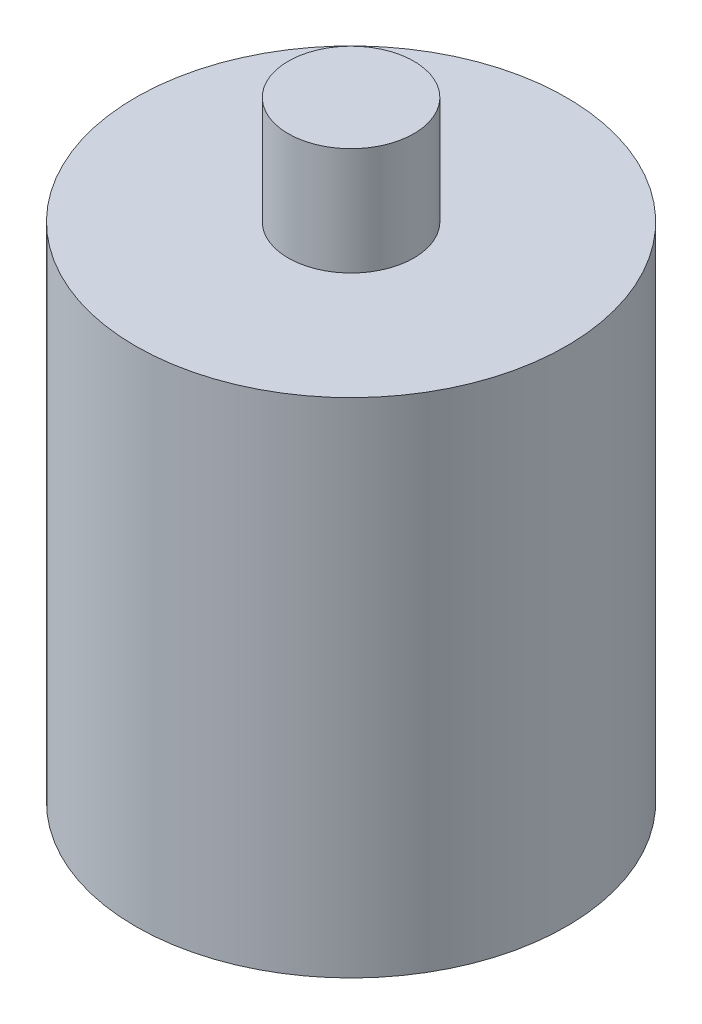
ISO-10303-21;
HEADER;
FILE_DESCRIPTION(('STEP AP214'),'2;1');
FILE_NAME('part.step','',(''),(''),'','','');
FILE_SCHEMA(('AUTOMOTIVE_DESIGN { 1 0 10303 214 1 1 1 1 }'));
ENDSEC;
DATA;
#1=APPLICATION_CONTEXT('core data for automotive mechanical design processes');
#2=APPLICATION_PROTOCOL_DEFINITION('international standard','automotive_design',2000,#1);
#3=PRODUCT_CONTEXT('',#1,'mechanical');
#4=PRODUCT('Part','Part','',(#3));
#5=PRODUCT_RELATED_PRODUCT_CATEGORY('part','',(#4));
#6=PRODUCT_DEFINITION_FORMATION('','',#4);
#7=PRODUCT_DEFINITION_CONTEXT('part definition',#1,'design');
#8=PRODUCT_DEFINITION('design','',#6,#7);
#9=PRODUCT_DEFINITION_SHAPE('','',#8);
#10=(LENGTH_UNIT() NAMED_UNIT(*) SI_UNIT(.MILLI.,.METRE.));
#11=(NAMED_UNIT(*) PLANE_ANGLE_UNIT() SI_UNIT($,.RADIAN.));
#12=(NAMED_UNIT(*) SI_UNIT($,.STERADIAN.) SOLID_ANGLE_UNIT());
#13=UNCERTAINTY_MEASURE_WITH_UNIT(LENGTH_MEASURE(1.E-05),#10,'distance_accuracy_value','');
#14=(GEOMETRIC_REPRESENTATION_CONTEXT(3) GLOBAL_UNCERTAINTY_ASSIGNED_CONTEXT((#13)) GLOBAL_UNIT_ASSIGNED_CONTEXT((#10,
#11,#12)) REPRESENTATION_CONTEXT('',''));
#15=CARTESIAN_POINT('',(0.,0.,0.));
#16=DIRECTION('',(0.,0.,1.));
#17=DIRECTION('',(1.,0.,0.));
#18=AXIS2_PLACEMENT_3D('',#15,#16,#17);
#19=CARTESIAN_POINT('',(0.,14.,0.));
#20=DIRECTION('',(0.,-1.,0.));
#21=DIRECTION('',(0.,0.,-1.));
#22=AXIS2_PLACEMENT_3D('',#19,#20,#21);
#23=CYLINDRICAL_SURFACE('',#22,6.);
#24=CARTESIAN_POINT('',(0.,14.,0.));
#25=DIRECTION('',(0.,1.,0.));
#26=DIRECTION('',(0.,0.,1.));
#27=AXIS2_PLACEMENT_3D('',#24,#25,#26);
#28=CIRCLE('',#27,6.);
#29=CARTESIAN_POINT('',(0.,14.,6.));
#30=VERTEX_POINT('',#29);
#31=EDGE_CURVE('E38',#30,#30,#28,.T.);
#32=ORIENTED_EDGE('',*,*,#31,.F.);
#33=EDGE_LOOP('',(#32));
#34=FACE_BOUND('',#33,.T.);
#35=CARTESIAN_POINT('',(0.,0.,0.));
#36=DIRECTION('',(0.,1.,0.));
#37=DIRECTION('',(0.,0.,1.));
#38=AXIS2_PLACEMENT_3D('',#35,#36,#37);
#39=CIRCLE('',#38,6.);
#40=CARTESIAN_POINT('',(0.,0.,6.));
#41=VERTEX_POINT('',#40);
#42=EDGE_CURVE('E34',#41,#41,#39,.T.);
#43=ORIENTED_EDGE('',*,*,#42,.T.);
#44=EDGE_LOOP('',(#43));
#45=FACE_BOUND('',#44,.T.);
#46=ADVANCED_FACE('F31',(#34,#45),#23,.T.);
#47=CARTESIAN_POINT('',(0.,14.,0.));
#48=DIRECTION('',(0.,1.,0.));
#49=DIRECTION('',(0.,0.,1.));
#50=AXIS2_PLACEMENT_3D('',#47,#48,#49);
#51=PLANE('',#50);
#52=CARTESIAN_POINT('',(0.,14.,0.));
#53=DIRECTION('',(0.,1.,0.));
#54=DIRECTION('',(0.,0.,1.));
#55=AXIS2_PLACEMENT_3D('',#52,#53,#54);
#56=CIRCLE('',#55,1.75);
#57=CARTESIAN_POINT('',(0.,14.,1.75));
#58=VERTEX_POINT('',#57);
#59=EDGE_CURVE('E10',#58,#58,#56,.T.);
#60=ORIENTED_EDGE('',*,*,#59,.F.);
#61=EDGE_LOOP('',(#60));
#62=FACE_BOUND('',#61,.T.);
#63=ORIENTED_EDGE('',*,*,#31,.T.);
#64=EDGE_LOOP('',(#63));
#65=FACE_BOUND('',#64,.T.);
#66=ADVANCED_FACE('F55',(#62,#65),#51,.T.);
#67=CARTESIAN_POINT('',(0.,0.,0.));
#68=DIRECTION('',(0.,1.,0.));
#69=DIRECTION('',(0.,0.,1.));
#70=AXIS2_PLACEMENT_3D('',#67,#68,#69);
#71=PLANE('',#70);
#72=ORIENTED_EDGE('',*,*,#42,.F.);
#73=EDGE_LOOP('',(#72));
#74=FACE_BOUND('',#73,.T.);
#75=ADVANCED_FACE('F52',(#74),#71,.F.);
#76=CARTESIAN_POINT('',(0.,17.,0.));
#77=DIRECTION('',(0.,-1.,0.));
#78=DIRECTION('',(0.,0.,-1.));
#79=AXIS2_PLACEMENT_3D('',#76,#77,#78);
#80=CYLINDRICAL_SURFACE('',#79,1.75);
#81=CARTESIAN_POINT('',(0.,17.,0.));
#82=DIRECTION('',(0.,1.,0.));
#83=DIRECTION('',(0.,0.,1.));
#84=AXIS2_PLACEMENT_3D('',#81,#82,#83);
#85=CIRCLE('',#84,1.75);
#86=CARTESIAN_POINT('',(0.,17.,1.75));
#87=VERTEX_POINT('',#86);
#88=EDGE_CURVE('E44',#87,#87,#85,.T.);
#89=ORIENTED_EDGE('',*,*,#88,.F.);
#90=EDGE_LOOP('',(#89));
#91=FACE_BOUND('',#90,.T.);
#92=ORIENTED_EDGE('',*,*,#59,.T.);
#93=EDGE_LOOP('',(#92));
#94=FACE_BOUND('',#93,.T.);
#95=ADVANCED_FACE('F54',(#91,#94),#80,.T.);
#96=CARTESIAN_POINT('',(0.,17.,0.));
#97=DIRECTION('',(0.,1.,0.));
#98=DIRECTION('',(0.,0.,1.));
#99=AXIS2_PLACEMENT_3D('',#96,#97,#98);
#100=PLANE('',#99);
#101=ORIENTED_EDGE('',*,*,#88,.T.);
#102=EDGE_LOOP('',(#101));
#103=FACE_BOUND('',#102,.T.);
#104=ADVANCED_FACE('F60',(#103),#100,.T.);
#105=CLOSED_SHELL('',(#46,#66,#75,#95,#104));
#106=MANIFOLD_SOLID_BREP('B2',#105);
#107=ADVANCED_BREP_SHAPE_REPRESENTATION('',(#18,#106),#14);
#108=SHAPE_DEFINITION_REPRESENTATION(#9,#107);
ENDSEC;
END-ISO-10303-21;
